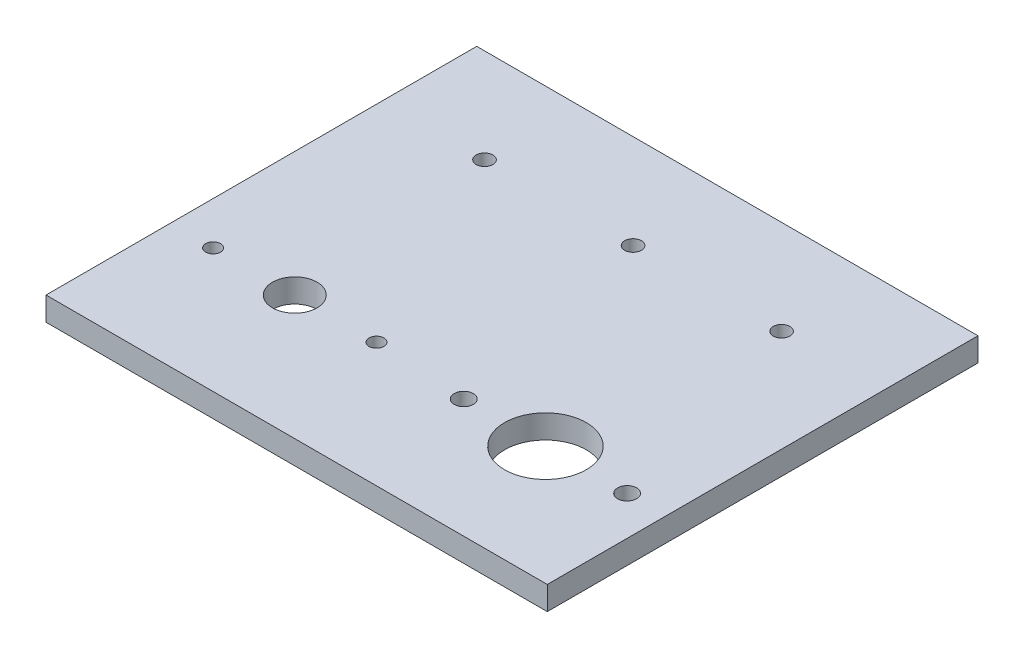
ISO-10303-21;
HEADER;
FILE_DESCRIPTION(('STEP AP214'),'2;1');
FILE_NAME('part.step','',(''),(''),'','','');
FILE_SCHEMA(('AUTOMOTIVE_DESIGN { 1 0 10303 214 1 1 1 1 }'));
ENDSEC;
DATA;
#1=APPLICATION_CONTEXT('core data for automotive mechanical design processes');
#2=APPLICATION_PROTOCOL_DEFINITION('international standard','automotive_design',2000,#1);
#3=PRODUCT_CONTEXT('',#1,'mechanical');
#4=PRODUCT('Part','Part','',(#3));
#5=PRODUCT_RELATED_PRODUCT_CATEGORY('part','',(#4));
#6=PRODUCT_DEFINITION_FORMATION('','',#4);
#7=PRODUCT_DEFINITION_CONTEXT('part definition',#1,'design');
#8=PRODUCT_DEFINITION('design','',#6,#7);
#9=PRODUCT_DEFINITION_SHAPE('','',#8);
#10=(LENGTH_UNIT() NAMED_UNIT(*) SI_UNIT(.MILLI.,.METRE.));
#11=(NAMED_UNIT(*) PLANE_ANGLE_UNIT() SI_UNIT($,.RADIAN.));
#12=(NAMED_UNIT(*) SI_UNIT($,.STERADIAN.) SOLID_ANGLE_UNIT());
#13=UNCERTAINTY_MEASURE_WITH_UNIT(LENGTH_MEASURE(1.E-05),#10,'distance_accuracy_value','');
#14=(GEOMETRIC_REPRESENTATION_CONTEXT(3) GLOBAL_UNCERTAINTY_ASSIGNED_CONTEXT((#13)) GLOBAL_UNIT_ASSIGNED_CONTEXT((#10,
#11,#12)) REPRESENTATION_CONTEXT('',''));
#15=CARTESIAN_POINT('',(0.,0.,0.));
#16=DIRECTION('',(0.,0.,1.));
#17=DIRECTION('',(1.,0.,0.));
#18=AXIS2_PLACEMENT_3D('',#15,#16,#17);
#19=CARTESIAN_POINT('',(0.,6.35,-58.));
#20=DIRECTION('',(0.,0.,1.));
#21=DIRECTION('',(1.,0.,0.));
#22=AXIS2_PLACEMENT_3D('',#19,#20,#21);
#23=PLANE('',#22);
#24=DIRECTION('',(-1.,0.,0.));
#25=VECTOR('',#24,1.);
#26=CARTESIAN_POINT('',(0.,0.,-58.));
#27=LINE('',#26,#25);
#28=CARTESIAN_POINT('',(32.5,0.,-58.));
#29=VERTEX_POINT('',#28);
#30=CARTESIAN_POINT('',(-102.5,0.,-58.));
#31=VERTEX_POINT('',#30);
#32=EDGE_CURVE('E101',#29,#31,#27,.T.);
#33=ORIENTED_EDGE('',*,*,#32,.T.);
#34=DIRECTION('',(0.,-1.,0.));
#35=VECTOR('',#34,1.);
#36=CARTESIAN_POINT('',(-102.5,6.35,-58.));
#37=LINE('',#36,#35);
#38=CARTESIAN_POINT('',(-102.5,6.35,-58.));
#39=VERTEX_POINT('',#38);
#40=EDGE_CURVE('E11',#39,#31,#37,.T.);
#41=ORIENTED_EDGE('',*,*,#40,.F.);
#42=DIRECTION('',(-1.,0.,0.));
#43=VECTOR('',#42,1.);
#44=CARTESIAN_POINT('',(0.,6.35,-58.));
#45=LINE('',#44,#43);
#46=CARTESIAN_POINT('',(32.5,6.35,-58.));
#47=VERTEX_POINT('',#46);
#48=EDGE_CURVE('E78',#47,#39,#45,.T.);
#49=ORIENTED_EDGE('',*,*,#48,.F.);
#50=DIRECTION('',(0.,-1.,0.));
#51=VECTOR('',#50,1.);
#52=CARTESIAN_POINT('',(32.5,6.35,-58.));
#53=LINE('',#52,#51);
#54=EDGE_CURVE('E97',#47,#29,#53,.T.);
#55=ORIENTED_EDGE('',*,*,#54,.T.);
#56=EDGE_LOOP('',(#33,#41,#49,#55));
#57=FACE_BOUND('',#56,.T.);
#58=ADVANCED_FACE('F39',(#57),#23,.F.);
#59=CARTESIAN_POINT('',(-102.5,6.35,0.));
#60=DIRECTION('',(-1.,0.,0.));
#61=DIRECTION('',(0.,0.,1.));
#62=AXIS2_PLACEMENT_3D('',#59,#60,#61);
#63=PLANE('',#62);
#64=DIRECTION('',(0.,0.,-1.));
#65=VECTOR('',#64,1.);
#66=CARTESIAN_POINT('',(-102.5,0.,0.));
#67=LINE('',#66,#65);
#68=CARTESIAN_POINT('',(-102.5,0.,58.));
#69=VERTEX_POINT('',#68);
#70=EDGE_CURVE('E87',#69,#31,#67,.T.);
#71=ORIENTED_EDGE('',*,*,#70,.F.);
#72=DIRECTION('',(0.,-1.,0.));
#73=VECTOR('',#72,1.);
#74=CARTESIAN_POINT('',(-102.5,6.35,58.));
#75=LINE('',#74,#73);
#76=CARTESIAN_POINT('',(-102.5,6.35,58.));
#77=VERTEX_POINT('',#76);
#78=EDGE_CURVE('E47',#77,#69,#75,.T.);
#79=ORIENTED_EDGE('',*,*,#78,.F.);
#80=DIRECTION('',(0.,0.,-1.));
#81=VECTOR('',#80,1.);
#82=CARTESIAN_POINT('',(-102.5,6.35,0.));
#83=LINE('',#82,#81);
#84=EDGE_CURVE('E85',#77,#39,#83,.T.);
#85=ORIENTED_EDGE('',*,*,#84,.T.);
#86=ORIENTED_EDGE('',*,*,#40,.T.);
#87=EDGE_LOOP('',(#71,#79,#85,#86));
#88=FACE_BOUND('',#87,.T.);
#89=ADVANCED_FACE('F84',(#88),#63,.T.);
#90=CARTESIAN_POINT('',(0.,6.35,58.));
#91=DIRECTION('',(0.,0.,1.));
#92=DIRECTION('',(1.,0.,0.));
#93=AXIS2_PLACEMENT_3D('',#90,#91,#92);
#94=PLANE('',#93);
#95=DIRECTION('',(-1.,0.,0.));
#96=VECTOR('',#95,1.);
#97=CARTESIAN_POINT('',(0.,0.,58.));
#98=LINE('',#97,#96);
#99=CARTESIAN_POINT('',(32.5,0.,58.));
#100=VERTEX_POINT('',#99);
#101=EDGE_CURVE('E106',#100,#69,#98,.T.);
#102=ORIENTED_EDGE('',*,*,#101,.F.);
#103=DIRECTION('',(0.,-1.,0.));
#104=VECTOR('',#103,1.);
#105=CARTESIAN_POINT('',(32.5,6.35,58.));
#106=LINE('',#105,#104);
#107=CARTESIAN_POINT('',(32.5,6.35,58.));
#108=VERTEX_POINT('',#107);
#109=EDGE_CURVE('E70',#108,#100,#106,.T.);
#110=ORIENTED_EDGE('',*,*,#109,.F.);
#111=DIRECTION('',(-1.,0.,0.));
#112=VECTOR('',#111,1.);
#113=CARTESIAN_POINT('',(0.,6.35,58.));
#114=LINE('',#113,#112);
#115=EDGE_CURVE('E93',#108,#77,#114,.T.);
#116=ORIENTED_EDGE('',*,*,#115,.T.);
#117=ORIENTED_EDGE('',*,*,#78,.T.);
#118=EDGE_LOOP('',(#102,#110,#116,#117));
#119=FACE_BOUND('',#118,.T.);
#120=ADVANCED_FACE('F95',(#119),#94,.T.);
#121=CARTESIAN_POINT('',(32.5,6.35,0.));
#122=DIRECTION('',(-1.,0.,0.));
#123=DIRECTION('',(0.,0.,1.));
#124=AXIS2_PLACEMENT_3D('',#121,#122,#123);
#125=PLANE('',#124);
#126=DIRECTION('',(0.,0.,-1.));
#127=VECTOR('',#126,1.);
#128=CARTESIAN_POINT('',(32.5,0.,0.));
#129=LINE('',#128,#127);
#130=EDGE_CURVE('E73',#100,#29,#129,.T.);
#131=ORIENTED_EDGE('',*,*,#130,.T.);
#132=ORIENTED_EDGE('',*,*,#54,.F.);
#133=DIRECTION('',(0.,0.,-1.));
#134=VECTOR('',#133,1.);
#135=CARTESIAN_POINT('',(32.5,6.35,0.));
#136=LINE('',#135,#134);
#137=EDGE_CURVE('E55',#108,#47,#136,.T.);
#138=ORIENTED_EDGE('',*,*,#137,.F.);
#139=ORIENTED_EDGE('',*,*,#109,.T.);
#140=EDGE_LOOP('',(#131,#132,#138,#139));
#141=FACE_BOUND('',#140,.T.);
#142=ADVANCED_FACE('F125',(#141),#125,.F.);
#143=CARTESIAN_POINT('',(0.,6.35,0.));
#144=DIRECTION('',(0.,1.,0.));
#145=DIRECTION('',(0.,0.,1.));
#146=AXIS2_PLACEMENT_3D('',#143,#144,#145);
#147=PLANE('',#146);
#148=CARTESIAN_POINT('',(-47.,6.35,24.5));
#149=DIRECTION('',(0.,1.,0.));
#150=DIRECTION('',(0.,0.,1.));
#151=AXIS2_PLACEMENT_3D('',#148,#149,#150);
#152=CIRCLE('',#151,2.);
#153=CARTESIAN_POINT('',(-47.,6.35,26.5));
#154=VERTEX_POINT('',#153);
#155=EDGE_CURVE('E313',#154,#154,#152,.T.);
#156=ORIENTED_EDGE('',*,*,#155,.F.);
#157=EDGE_LOOP('',(#156));
#158=FACE_BOUND('',#157,.T.);
#159=CARTESIAN_POINT('',(-91.,6.35,24.5));
#160=DIRECTION('',(0.,1.,0.));
#161=DIRECTION('',(0.,0.,1.));
#162=AXIS2_PLACEMENT_3D('',#159,#160,#161);
#163=CIRCLE('',#162,2.);
#164=CARTESIAN_POINT('',(-91.,6.35,26.5));
#165=VERTEX_POINT('',#164);
#166=EDGE_CURVE('E318',#165,#165,#163,.T.);
#167=ORIENTED_EDGE('',*,*,#166,.F.);
#168=EDGE_LOOP('',(#167));
#169=FACE_BOUND('',#168,.T.);
#170=CARTESIAN_POINT('',(-69.,6.35,24.5));
#171=DIRECTION('',(0.,1.,0.));
#172=DIRECTION('',(0.,0.,1.));
#173=AXIS2_PLACEMENT_3D('',#170,#171,#172);
#174=CIRCLE('',#173,6.);
#175=CARTESIAN_POINT('',(-69.,6.35,30.5));
#176=VERTEX_POINT('',#175);
#177=EDGE_CURVE('E307',#176,#176,#174,.T.);
#178=ORIENTED_EDGE('',*,*,#177,.F.);
#179=EDGE_LOOP('',(#178));
#180=FACE_BOUND('',#179,.T.);
#181=CARTESIAN_POINT('',(-75.,6.35,-32.6));
#182=DIRECTION('',(0.,1.,0.));
#183=DIRECTION('',(0.,0.,1.));
#184=AXIS2_PLACEMENT_3D('',#181,#182,#183);
#185=CIRCLE('',#184,2.25);
#186=CARTESIAN_POINT('',(-75.,6.35,-30.35));
#187=VERTEX_POINT('',#186);
#188=EDGE_CURVE('E303',#187,#187,#185,.T.);
#189=ORIENTED_EDGE('',*,*,#188,.F.);
#190=EDGE_LOOP('',(#189));
#191=FACE_BOUND('',#190,.T.);
#192=CARTESIAN_POINT('',(-35.,6.35,-32.6));
#193=DIRECTION('',(0.,1.,0.));
#194=DIRECTION('',(0.,0.,1.));
#195=AXIS2_PLACEMENT_3D('',#192,#193,#194);
#196=CIRCLE('',#195,2.25);
#197=CARTESIAN_POINT('',(-35.,6.35,-30.35));
#198=VERTEX_POINT('',#197);
#199=EDGE_CURVE('E297',#198,#198,#196,.T.);
#200=ORIENTED_EDGE('',*,*,#199,.F.);
#201=EDGE_LOOP('',(#200));
#202=FACE_BOUND('',#201,.T.);
#203=CARTESIAN_POINT('',(5.,6.35,-32.6));
#204=DIRECTION('',(0.,1.,0.));
#205=DIRECTION('',(0.,0.,1.));
#206=AXIS2_PLACEMENT_3D('',#203,#204,#205);
#207=CIRCLE('',#206,2.25);
#208=CARTESIAN_POINT('',(5.,6.35,-30.35));
#209=VERTEX_POINT('',#208);
#210=EDGE_CURVE('E291',#209,#209,#207,.T.);
#211=ORIENTED_EDGE('',*,*,#210,.F.);
#212=EDGE_LOOP('',(#211));
#213=FACE_BOUND('',#212,.T.);
#214=CARTESIAN_POINT('',(0.,6.35,25.996));
#215=DIRECTION('',(0.,1.,0.));
#216=DIRECTION('',(0.,0.,1.));
#217=AXIS2_PLACEMENT_3D('',#214,#215,#216);
#218=CIRCLE('',#217,11.);
#219=CARTESIAN_POINT('',(0.,6.35,36.996));
#220=VERTEX_POINT('',#219);
#221=EDGE_CURVE('E274',#220,#220,#218,.T.);
#222=ORIENTED_EDGE('',*,*,#221,.F.);
#223=EDGE_LOOP('',(#222));
#224=FACE_BOUND('',#223,.T.);
#225=CARTESIAN_POINT('',(-22.,6.35,25.996));
#226=DIRECTION('',(0.,1.,0.));
#227=DIRECTION('',(0.,0.,1.));
#228=AXIS2_PLACEMENT_3D('',#225,#226,#227);
#229=CIRCLE('',#228,2.5527);
#230=CARTESIAN_POINT('',(-22.,6.35,28.5487));
#231=VERTEX_POINT('',#230);
#232=EDGE_CURVE('E267',#231,#231,#229,.T.);
#233=ORIENTED_EDGE('',*,*,#232,.F.);
#234=EDGE_LOOP('',(#233));
#235=FACE_BOUND('',#234,.T.);
#236=CARTESIAN_POINT('',(22.,6.35,25.996));
#237=DIRECTION('',(0.,1.,0.));
#238=DIRECTION('',(0.,0.,1.));
#239=AXIS2_PLACEMENT_3D('',#236,#237,#238);
#240=CIRCLE('',#239,2.5527);
#241=CARTESIAN_POINT('',(22.,6.35,28.5487));
#242=VERTEX_POINT('',#241);
#243=EDGE_CURVE('E271',#242,#242,#240,.T.);
#244=ORIENTED_EDGE('',*,*,#243,.F.);
#245=EDGE_LOOP('',(#244));
#246=FACE_BOUND('',#245,.T.);
#247=ORIENTED_EDGE('',*,*,#48,.T.);
#248=ORIENTED_EDGE('',*,*,#84,.F.);
#249=ORIENTED_EDGE('',*,*,#115,.F.);
#250=ORIENTED_EDGE('',*,*,#137,.T.);
#251=EDGE_LOOP('',(#247,#248,#249,#250));
#252=FACE_BOUND('',#251,.T.);
#253=ADVANCED_FACE('F92',(#158,#169,#180,#191,#202,#213,#224,#235,#246,#252),#147,.T.);
#254=CARTESIAN_POINT('',(0.,0.,0.));
#255=DIRECTION('',(0.,1.,0.));
#256=DIRECTION('',(0.,0.,1.));
#257=AXIS2_PLACEMENT_3D('',#254,#255,#256);
#258=PLANE('',#257);
#259=CARTESIAN_POINT('',(-47.,0.,24.5));
#260=DIRECTION('',(0.,1.,0.));
#261=DIRECTION('',(0.,0.,1.));
#262=AXIS2_PLACEMENT_3D('',#259,#260,#261);
#263=CIRCLE('',#262,2.);
#264=CARTESIAN_POINT('',(-47.,0.,26.5));
#265=VERTEX_POINT('',#264);
#266=EDGE_CURVE('E316',#265,#265,#263,.T.);
#267=ORIENTED_EDGE('',*,*,#266,.T.);
#268=EDGE_LOOP('',(#267));
#269=FACE_BOUND('',#268,.T.);
#270=CARTESIAN_POINT('',(-91.,0.,24.5));
#271=DIRECTION('',(0.,1.,0.));
#272=DIRECTION('',(0.,0.,1.));
#273=AXIS2_PLACEMENT_3D('',#270,#271,#272);
#274=CIRCLE('',#273,2.);
#275=CARTESIAN_POINT('',(-91.,0.,26.5));
#276=VERTEX_POINT('',#275);
#277=EDGE_CURVE('E310',#276,#276,#274,.T.);
#278=ORIENTED_EDGE('',*,*,#277,.T.);
#279=EDGE_LOOP('',(#278));
#280=FACE_BOUND('',#279,.T.);
#281=CARTESIAN_POINT('',(-69.,0.,24.5));
#282=DIRECTION('',(0.,1.,0.));
#283=DIRECTION('',(0.,0.,1.));
#284=AXIS2_PLACEMENT_3D('',#281,#282,#283);
#285=CIRCLE('',#284,6.);
#286=CARTESIAN_POINT('',(-69.,0.,30.5));
#287=VERTEX_POINT('',#286);
#288=EDGE_CURVE('E306',#287,#287,#285,.T.);
#289=ORIENTED_EDGE('',*,*,#288,.T.);
#290=EDGE_LOOP('',(#289));
#291=FACE_BOUND('',#290,.T.);
#292=CARTESIAN_POINT('',(-75.,0.,-32.6));
#293=DIRECTION('',(0.,1.,0.));
#294=DIRECTION('',(0.,0.,1.));
#295=AXIS2_PLACEMENT_3D('',#292,#293,#294);
#296=CIRCLE('',#295,2.25);
#297=CARTESIAN_POINT('',(-75.,0.,-30.35));
#298=VERTEX_POINT('',#297);
#299=EDGE_CURVE('E300',#298,#298,#296,.T.);
#300=ORIENTED_EDGE('',*,*,#299,.T.);
#301=EDGE_LOOP('',(#300));
#302=FACE_BOUND('',#301,.T.);
#303=CARTESIAN_POINT('',(-35.,0.,-32.6));
#304=DIRECTION('',(0.,1.,0.));
#305=DIRECTION('',(0.,0.,1.));
#306=AXIS2_PLACEMENT_3D('',#303,#304,#305);
#307=CIRCLE('',#306,2.25);
#308=CARTESIAN_POINT('',(-35.,0.,-30.35));
#309=VERTEX_POINT('',#308);
#310=EDGE_CURVE('E294',#309,#309,#307,.T.);
#311=ORIENTED_EDGE('',*,*,#310,.T.);
#312=EDGE_LOOP('',(#311));
#313=FACE_BOUND('',#312,.T.);
#314=CARTESIAN_POINT('',(5.,0.,-32.6));
#315=DIRECTION('',(0.,1.,0.));
#316=DIRECTION('',(0.,0.,1.));
#317=AXIS2_PLACEMENT_3D('',#314,#315,#316);
#318=CIRCLE('',#317,2.25);
#319=CARTESIAN_POINT('',(5.,0.,-30.35));
#320=VERTEX_POINT('',#319);
#321=EDGE_CURVE('E287',#320,#320,#318,.T.);
#322=ORIENTED_EDGE('',*,*,#321,.T.);
#323=EDGE_LOOP('',(#322));
#324=FACE_BOUND('',#323,.T.);
#325=CARTESIAN_POINT('',(0.,0.,25.996));
#326=DIRECTION('',(0.,1.,0.));
#327=DIRECTION('',(0.,0.,1.));
#328=AXIS2_PLACEMENT_3D('',#325,#326,#327);
#329=CIRCLE('',#328,11.);
#330=CARTESIAN_POINT('',(0.,0.,36.996));
#331=VERTEX_POINT('',#330);
#332=EDGE_CURVE('E269',#331,#331,#329,.T.);
#333=ORIENTED_EDGE('',*,*,#332,.T.);
#334=EDGE_LOOP('',(#333));
#335=FACE_BOUND('',#334,.T.);
#336=CARTESIAN_POINT('',(-22.,0.,25.996));
#337=DIRECTION('',(0.,1.,0.));
#338=DIRECTION('',(0.,0.,1.));
#339=AXIS2_PLACEMENT_3D('',#336,#337,#338);
#340=CIRCLE('',#339,2.5527);
#341=CARTESIAN_POINT('',(-22.,0.,28.5487));
#342=VERTEX_POINT('',#341);
#343=EDGE_CURVE('E264',#342,#342,#340,.T.);
#344=ORIENTED_EDGE('',*,*,#343,.T.);
#345=EDGE_LOOP('',(#344));
#346=FACE_BOUND('',#345,.T.);
#347=CARTESIAN_POINT('',(22.,0.,25.996));
#348=DIRECTION('',(0.,1.,0.));
#349=DIRECTION('',(0.,0.,1.));
#350=AXIS2_PLACEMENT_3D('',#347,#348,#349);
#351=CIRCLE('',#350,2.5527);
#352=CARTESIAN_POINT('',(22.,0.,28.5487));
#353=VERTEX_POINT('',#352);
#354=EDGE_CURVE('E104',#353,#353,#351,.T.);
#355=ORIENTED_EDGE('',*,*,#354,.T.);
#356=EDGE_LOOP('',(#355));
#357=FACE_BOUND('',#356,.T.);
#358=ORIENTED_EDGE('',*,*,#32,.F.);
#359=ORIENTED_EDGE('',*,*,#130,.F.);
#360=ORIENTED_EDGE('',*,*,#101,.T.);
#361=ORIENTED_EDGE('',*,*,#70,.T.);
#362=EDGE_LOOP('',(#358,#359,#360,#361));
#363=FACE_BOUND('',#362,.T.);
#364=ADVANCED_FACE('F113',(#269,#280,#291,#302,#313,#324,#335,#346,#357,#363),#258,.F.);
#365=CARTESIAN_POINT('',(22.,6.35,25.996));
#366=DIRECTION('',(0.,1.,0.));
#367=DIRECTION('',(0.,0.,1.));
#368=AXIS2_PLACEMENT_3D('',#365,#366,#367);
#369=CYLINDRICAL_SURFACE('',#368,2.5527);
#370=ORIENTED_EDGE('',*,*,#354,.F.);
#371=EDGE_LOOP('',(#370));
#372=FACE_BOUND('',#371,.T.);
#373=ORIENTED_EDGE('',*,*,#243,.T.);
#374=EDGE_LOOP('',(#373));
#375=FACE_BOUND('',#374,.T.);
#376=ADVANCED_FACE('F115',(#372,#375),#369,.F.);
#377=CARTESIAN_POINT('',(-22.,6.35,25.996));
#378=DIRECTION('',(0.,1.,0.));
#379=DIRECTION('',(0.,0.,1.));
#380=AXIS2_PLACEMENT_3D('',#377,#378,#379);
#381=CYLINDRICAL_SURFACE('',#380,2.5527);
#382=ORIENTED_EDGE('',*,*,#343,.F.);
#383=EDGE_LOOP('',(#382));
#384=FACE_BOUND('',#383,.T.);
#385=ORIENTED_EDGE('',*,*,#232,.T.);
#386=EDGE_LOOP('',(#385));
#387=FACE_BOUND('',#386,.T.);
#388=ADVANCED_FACE('F122',(#384,#387),#381,.F.);
#389=CARTESIAN_POINT('',(0.,0.,25.996));
#390=DIRECTION('',(0.,1.,0.));
#391=DIRECTION('',(0.,0.,1.));
#392=AXIS2_PLACEMENT_3D('',#389,#390,#391);
#393=CYLINDRICAL_SURFACE('',#392,11.);
#394=ORIENTED_EDGE('',*,*,#332,.F.);
#395=EDGE_LOOP('',(#394));
#396=FACE_BOUND('',#395,.T.);
#397=ORIENTED_EDGE('',*,*,#221,.T.);
#398=EDGE_LOOP('',(#397));
#399=FACE_BOUND('',#398,.T.);
#400=ADVANCED_FACE('F223',(#396,#399),#393,.F.);
#401=CARTESIAN_POINT('',(5.,6.35,-32.6));
#402=DIRECTION('',(0.,1.,0.));
#403=DIRECTION('',(0.,0.,1.));
#404=AXIS2_PLACEMENT_3D('',#401,#402,#403);
#405=CYLINDRICAL_SURFACE('',#404,2.25);
#406=ORIENTED_EDGE('',*,*,#321,.F.);
#407=EDGE_LOOP('',(#406));
#408=FACE_BOUND('',#407,.T.);
#409=ORIENTED_EDGE('',*,*,#210,.T.);
#410=EDGE_LOOP('',(#409));
#411=FACE_BOUND('',#410,.T.);
#412=ADVANCED_FACE('F214',(#408,#411),#405,.F.);
#413=CARTESIAN_POINT('',(-35.,6.35,-32.6));
#414=DIRECTION('',(0.,1.,0.));
#415=DIRECTION('',(0.,0.,1.));
#416=AXIS2_PLACEMENT_3D('',#413,#414,#415);
#417=CYLINDRICAL_SURFACE('',#416,2.25);
#418=ORIENTED_EDGE('',*,*,#310,.F.);
#419=EDGE_LOOP('',(#418));
#420=FACE_BOUND('',#419,.T.);
#421=ORIENTED_EDGE('',*,*,#199,.T.);
#422=EDGE_LOOP('',(#421));
#423=FACE_BOUND('',#422,.T.);
#424=ADVANCED_FACE('F205',(#420,#423),#417,.F.);
#425=CARTESIAN_POINT('',(-75.,6.35,-32.6));
#426=DIRECTION('',(0.,1.,0.));
#427=DIRECTION('',(0.,0.,1.));
#428=AXIS2_PLACEMENT_3D('',#425,#426,#427);
#429=CYLINDRICAL_SURFACE('',#428,2.25);
#430=ORIENTED_EDGE('',*,*,#299,.F.);
#431=EDGE_LOOP('',(#430));
#432=FACE_BOUND('',#431,.T.);
#433=ORIENTED_EDGE('',*,*,#188,.T.);
#434=EDGE_LOOP('',(#433));
#435=FACE_BOUND('',#434,.T.);
#436=ADVANCED_FACE('F156',(#432,#435),#429,.F.);
#437=CARTESIAN_POINT('',(-69.,0.,24.5));
#438=DIRECTION('',(0.,1.,0.));
#439=DIRECTION('',(0.,0.,1.));
#440=AXIS2_PLACEMENT_3D('',#437,#438,#439);
#441=CYLINDRICAL_SURFACE('',#440,6.);
#442=ORIENTED_EDGE('',*,*,#288,.F.);
#443=EDGE_LOOP('',(#442));
#444=FACE_BOUND('',#443,.T.);
#445=ORIENTED_EDGE('',*,*,#177,.T.);
#446=EDGE_LOOP('',(#445));
#447=FACE_BOUND('',#446,.T.);
#448=ADVANCED_FACE('F167',(#444,#447),#441,.F.);
#449=CARTESIAN_POINT('',(-91.,0.,24.5));
#450=DIRECTION('',(0.,1.,0.));
#451=DIRECTION('',(0.,0.,1.));
#452=AXIS2_PLACEMENT_3D('',#449,#450,#451);
#453=CYLINDRICAL_SURFACE('',#452,2.);
#454=ORIENTED_EDGE('',*,*,#277,.F.);
#455=EDGE_LOOP('',(#454));
#456=FACE_BOUND('',#455,.T.);
#457=ORIENTED_EDGE('',*,*,#166,.T.);
#458=EDGE_LOOP('',(#457));
#459=FACE_BOUND('',#458,.T.);
#460=ADVANCED_FACE('F172',(#456,#459),#453,.F.);
#461=CARTESIAN_POINT('',(-47.,0.,24.5));
#462=DIRECTION('',(0.,1.,0.));
#463=DIRECTION('',(0.,0.,1.));
#464=AXIS2_PLACEMENT_3D('',#461,#462,#463);
#465=CYLINDRICAL_SURFACE('',#464,2.);
#466=ORIENTED_EDGE('',*,*,#266,.F.);
#467=EDGE_LOOP('',(#466));
#468=FACE_BOUND('',#467,.T.);
#469=ORIENTED_EDGE('',*,*,#155,.T.);
#470=EDGE_LOOP('',(#469));
#471=FACE_BOUND('',#470,.T.);
#472=ADVANCED_FACE('F183',(#468,#471),#465,.F.);
#473=CLOSED_SHELL('',(#58,#89,#120,#142,#253,#364,#376,#388,#400,#412,#424,#436,#448,#460,#472));
#474=MANIFOLD_SOLID_BREP('B2',#473);
#475=ADVANCED_BREP_SHAPE_REPRESENTATION('',(#18,#474),#14);
#476=SHAPE_DEFINITION_REPRESENTATION(#9,#475);
ENDSEC;
END-ISO-10303-21;
